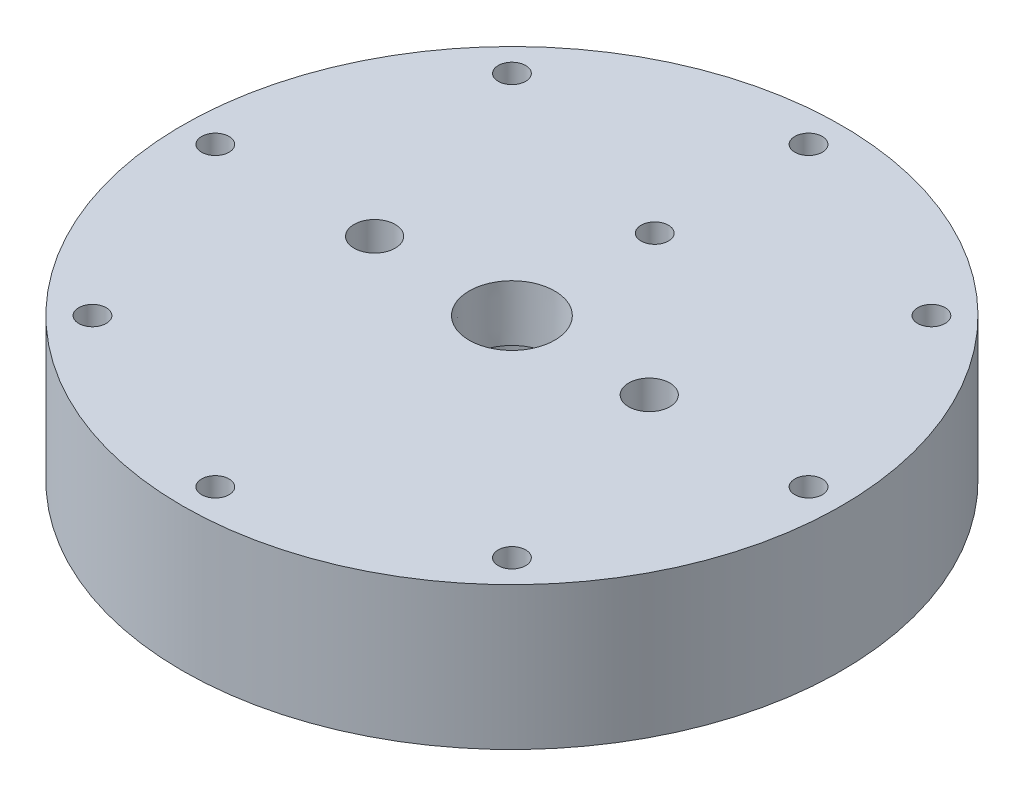
ISO-10303-21;
HEADER;
FILE_DESCRIPTION(('STEP AP214'),'2;1');
FILE_NAME('part.step','',(''),(''),'','','');
FILE_SCHEMA(('AUTOMOTIVE_DESIGN { 1 0 10303 214 1 1 1 1 }'));
ENDSEC;
DATA;
#1=APPLICATION_CONTEXT('core data for automotive mechanical design processes');
#2=APPLICATION_PROTOCOL_DEFINITION('international standard','automotive_design',2000,#1);
#3=PRODUCT_CONTEXT('',#1,'mechanical');
#4=PRODUCT('Part','Part','',(#3));
#5=PRODUCT_RELATED_PRODUCT_CATEGORY('part','',(#4));
#6=PRODUCT_DEFINITION_FORMATION('','',#4);
#7=PRODUCT_DEFINITION_CONTEXT('part definition',#1,'design');
#8=PRODUCT_DEFINITION('design','',#6,#7);
#9=PRODUCT_DEFINITION_SHAPE('','',#8);
#10=(LENGTH_UNIT() NAMED_UNIT(*) SI_UNIT(.MILLI.,.METRE.));
#11=(NAMED_UNIT(*) PLANE_ANGLE_UNIT() SI_UNIT($,.RADIAN.));
#12=(NAMED_UNIT(*) SI_UNIT($,.STERADIAN.) SOLID_ANGLE_UNIT());
#13=UNCERTAINTY_MEASURE_WITH_UNIT(LENGTH_MEASURE(1.E-05),#10,'distance_accuracy_value','');
#14=(GEOMETRIC_REPRESENTATION_CONTEXT(3) GLOBAL_UNCERTAINTY_ASSIGNED_CONTEXT((#13)) GLOBAL_UNIT_ASSIGNED_CONTEXT((#10,
#11,#12)) REPRESENTATION_CONTEXT('',''));
#15=CARTESIAN_POINT('',(0.,0.,0.));
#16=DIRECTION('',(0.,0.,1.));
#17=DIRECTION('',(1.,0.,0.));
#18=AXIS2_PLACEMENT_3D('',#15,#16,#17);
#19=CARTESIAN_POINT('',(0.,-40.64,0.));
#20=DIRECTION('',(0.,1.,0.));
#21=DIRECTION('',(0.,0.,1.));
#22=AXIS2_PLACEMENT_3D('',#19,#20,#21);
#23=PLANE('',#22);
#24=CARTESIAN_POINT('',(0.,-40.64,-33.02));
#25=DIRECTION('',(0.,1.,0.));
#26=DIRECTION('',(0.,0.,1.));
#27=AXIS2_PLACEMENT_3D('',#24,#25,#26);
#28=CIRCLE('',#27,3.175);
#29=CARTESIAN_POINT('',(0.,-40.64,-29.845));
#30=VERTEX_POINT('',#29);
#31=EDGE_CURVE('E78',#30,#30,#28,.F.);
#32=ORIENTED_EDGE('',*,*,#31,.F.);
#33=EDGE_LOOP('',(#32));
#34=FACE_BOUND('',#33,.T.);
#35=CARTESIAN_POINT('',(0.,-40.64,-33.02));
#36=DIRECTION('',(0.,1.,0.));
#37=DIRECTION('',(0.,0.,1.));
#38=AXIS2_PLACEMENT_3D('',#35,#36,#37);
#39=CIRCLE('',#38,7.62);
#40=CARTESIAN_POINT('',(0.,-40.64,-40.64));
#41=VERTEX_POINT('',#40);
#42=EDGE_CURVE('E59',#41,#41,#39,.F.);
#43=ORIENTED_EDGE('',*,*,#42,.T.);
#44=EDGE_LOOP('',(#43));
#45=FACE_BOUND('',#44,.T.);
#46=ADVANCED_FACE('F35',(#34,#45),#23,.F.);
#47=CARTESIAN_POINT('',(0.,-36.83,0.));
#48=DIRECTION('',(0.,-1.,0.));
#49=DIRECTION('',(0.,0.,-1.));
#50=AXIS2_PLACEMENT_3D('',#47,#48,#49);
#51=CYLINDRICAL_SURFACE('',#50,19.05);
#52=CARTESIAN_POINT('',(0.,-40.64,0.));
#53=DIRECTION('',(0.,1.,0.));
#54=DIRECTION('',(0.,0.,1.));
#55=AXIS2_PLACEMENT_3D('',#52,#53,#54);
#56=CIRCLE('',#55,19.05);
#57=CARTESIAN_POINT('',(0.,-40.64,19.05));
#58=VERTEX_POINT('',#57);
#59=EDGE_CURVE('E55',#58,#58,#56,.T.);
#60=ORIENTED_EDGE('',*,*,#59,.F.);
#61=EDGE_LOOP('',(#60));
#62=FACE_BOUND('',#61,.T.);
#63=CARTESIAN_POINT('',(0.,-36.83,0.));
#64=DIRECTION('',(0.,1.,0.));
#65=DIRECTION('',(0.,0.,1.));
#66=AXIS2_PLACEMENT_3D('',#63,#64,#65);
#67=CIRCLE('',#66,19.05);
#68=CARTESIAN_POINT('',(0.,-36.83,19.05));
#69=VERTEX_POINT('',#68);
#70=EDGE_CURVE('E43',#69,#69,#67,.T.);
#71=ORIENTED_EDGE('',*,*,#70,.T.);
#72=EDGE_LOOP('',(#71));
#73=FACE_BOUND('',#72,.T.);
#74=ADVANCED_FACE('F170',(#62,#73),#51,.F.);
#75=CARTESIAN_POINT('',(0.,-36.83,0.));
#76=DIRECTION('',(0.,1.,0.));
#77=DIRECTION('',(0.,0.,1.));
#78=AXIS2_PLACEMENT_3D('',#75,#76,#77);
#79=PLANE('',#78);
#80=CARTESIAN_POINT('',(0.,-36.83,0.));
#81=DIRECTION('',(0.,1.,0.));
#82=DIRECTION('',(0.,0.,1.));
#83=AXIS2_PLACEMENT_3D('',#80,#81,#82);
#84=CIRCLE('',#83,13.97);
#85=CARTESIAN_POINT('',(0.,-36.83,13.97));
#86=VERTEX_POINT('',#85);
#87=EDGE_CURVE('E48',#86,#86,#84,.F.);
#88=ORIENTED_EDGE('',*,*,#87,.F.);
#89=EDGE_LOOP('',(#88));
#90=FACE_BOUND('',#89,.T.);
#91=ORIENTED_EDGE('',*,*,#70,.F.);
#92=EDGE_LOOP('',(#91));
#93=FACE_BOUND('',#92,.T.);
#94=ADVANCED_FACE('F165',(#90,#93),#79,.F.);
#95=CARTESIAN_POINT('',(0.,-30.48,0.));
#96=DIRECTION('',(0.,-1.,0.));
#97=DIRECTION('',(0.,0.,-1.));
#98=AXIS2_PLACEMENT_3D('',#95,#96,#97);
#99=CYLINDRICAL_SURFACE('',#98,13.97);
#100=CARTESIAN_POINT('',(0.,-30.48,0.));
#101=DIRECTION('',(0.,1.,0.));
#102=DIRECTION('',(0.,0.,1.));
#103=AXIS2_PLACEMENT_3D('',#100,#101,#102);
#104=CIRCLE('',#103,13.97);
#105=CARTESIAN_POINT('',(0.,-30.48,13.97));
#106=VERTEX_POINT('',#105);
#107=EDGE_CURVE('E54',#106,#106,#104,.T.);
#108=ORIENTED_EDGE('',*,*,#107,.T.);
#109=EDGE_LOOP('',(#108));
#110=FACE_BOUND('',#109,.T.);
#111=ORIENTED_EDGE('',*,*,#87,.T.);
#112=EDGE_LOOP('',(#111));
#113=FACE_BOUND('',#112,.T.);
#114=ADVANCED_FACE('F150',(#110,#113),#99,.F.);
#115=CARTESIAN_POINT('',(0.,-30.48,0.));
#116=DIRECTION('',(0.,1.,0.));
#117=DIRECTION('',(0.,0.,1.));
#118=AXIS2_PLACEMENT_3D('',#115,#116,#117);
#119=PLANE('',#118);
#120=CARTESIAN_POINT('',(0.,-30.48,0.));
#121=DIRECTION('',(0.,1.,0.));
#122=DIRECTION('',(0.,0.,1.));
#123=AXIS2_PLACEMENT_3D('',#120,#121,#122);
#124=CIRCLE('',#123,9.50254209253425);
#125=CARTESIAN_POINT('',(0.,-30.48,9.50254209253425));
#126=VERTEX_POINT('',#125);
#127=EDGE_CURVE('E72',#126,#126,#124,.T.);
#128=ORIENTED_EDGE('',*,*,#127,.T.);
#129=EDGE_LOOP('',(#128));
#130=FACE_BOUND('',#129,.T.);
#131=ORIENTED_EDGE('',*,*,#107,.F.);
#132=EDGE_LOOP('',(#131));
#133=FACE_BOUND('',#132,.T.);
#134=ADVANCED_FACE('F153',(#130,#133),#119,.F.);
#135=CARTESIAN_POINT('',(0.,-40.64,0.));
#136=DIRECTION('',(0.,-1.,0.));
#137=DIRECTION('',(0.,0.,-1.));
#138=AXIS2_PLACEMENT_3D('',#135,#136,#137);
#139=CYLINDRICAL_SURFACE('',#138,57.15);
#140=CARTESIAN_POINT('',(0.,-40.64,0.));
#141=DIRECTION('',(0.,1.,0.));
#142=DIRECTION('',(0.,0.,1.));
#143=AXIS2_PLACEMENT_3D('',#140,#141,#142);
#144=CIRCLE('',#143,57.15);
#145=CARTESIAN_POINT('',(0.,-40.64,57.15));
#146=VERTEX_POINT('',#145);
#147=EDGE_CURVE('E58',#146,#146,#144,.T.);
#148=ORIENTED_EDGE('',*,*,#147,.T.);
#149=EDGE_LOOP('',(#148));
#150=FACE_BOUND('',#149,.T.);
#151=CARTESIAN_POINT('',(0.,-50.8,0.));
#152=DIRECTION('',(0.,1.,0.));
#153=DIRECTION('',(0.,0.,1.));
#154=AXIS2_PLACEMENT_3D('',#151,#152,#153);
#155=CIRCLE('',#154,57.15);
#156=CARTESIAN_POINT('',(0.,-50.8,57.15));
#157=VERTEX_POINT('',#156);
#158=EDGE_CURVE('E89',#157,#157,#155,.T.);
#159=ORIENTED_EDGE('',*,*,#158,.F.);
#160=EDGE_LOOP('',(#159));
#161=FACE_BOUND('',#160,.T.);
#162=ADVANCED_FACE('F155',(#150,#161),#139,.F.);
#163=CARTESIAN_POINT('',(0.,-40.64,-33.02));
#164=DIRECTION('',(0.,1.,0.));
#165=DIRECTION('',(0.,0.,1.));
#166=AXIS2_PLACEMENT_3D('',#163,#164,#165);
#167=CIRCLE('',#166,10.16);
#168=CARTESIAN_POINT('',(0.,-40.64,-43.18));
#169=VERTEX_POINT('',#168);
#170=EDGE_CURVE('E39',#169,#169,#167,.F.);
#171=ORIENTED_EDGE('',*,*,#170,.F.);
#172=EDGE_LOOP('',(#171));
#173=FACE_BOUND('',#172,.T.);
#174=CARTESIAN_POINT('',(-31.75,-40.64,0.));
#175=DIRECTION('',(0.,1.,0.));
#176=DIRECTION('',(0.,0.,1.));
#177=AXIS2_PLACEMENT_3D('',#174,#175,#176);
#178=CIRCLE('',#177,4.7625);
#179=CARTESIAN_POINT('',(-31.75,-40.64,4.7625));
#180=VERTEX_POINT('',#179);
#181=EDGE_CURVE('E85',#180,#180,#178,.F.);
#182=ORIENTED_EDGE('',*,*,#181,.F.);
#183=EDGE_LOOP('',(#182));
#184=FACE_BOUND('',#183,.T.);
#185=CARTESIAN_POINT('',(31.75,-40.64,0.));
#186=DIRECTION('',(0.,1.,0.));
#187=DIRECTION('',(0.,0.,1.));
#188=AXIS2_PLACEMENT_3D('',#185,#186,#187);
#189=CIRCLE('',#188,4.7625);
#190=CARTESIAN_POINT('',(31.75,-40.64,4.7625));
#191=VERTEX_POINT('',#190);
#192=EDGE_CURVE('E86',#191,#191,#189,.F.);
#193=ORIENTED_EDGE('',*,*,#192,.F.);
#194=EDGE_LOOP('',(#193));
#195=FACE_BOUND('',#194,.T.);
#196=ORIENTED_EDGE('',*,*,#59,.T.);
#197=EDGE_LOOP('',(#196));
#198=FACE_BOUND('',#197,.T.);
#199=ORIENTED_EDGE('',*,*,#147,.F.);
#200=EDGE_LOOP('',(#199));
#201=FACE_BOUND('',#200,.T.);
#202=ADVANCED_FACE('F162',(#173,#184,#195,#198,#201),#23,.F.);
#203=CARTESIAN_POINT('',(0.,-17.78,0.));
#204=DIRECTION('',(0.,1.,0.));
#205=DIRECTION('',(0.,0.,1.));
#206=AXIS2_PLACEMENT_3D('',#203,#204,#205);
#207=PLANE('',#206);
#208=CARTESIAN_POINT('',(0.,-17.78,0.));
#209=DIRECTION('',(0.,1.,0.));
#210=DIRECTION('',(0.,0.,1.));
#211=AXIS2_PLACEMENT_3D('',#208,#209,#210);
#212=CIRCLE('',#211,9.8827971);
#213=CARTESIAN_POINT('',(0.,-17.78,9.8827971));
#214=VERTEX_POINT('',#213);
#215=EDGE_CURVE('E464',#214,#214,#212,.T.);
#216=ORIENTED_EDGE('',*,*,#215,.F.);
#217=EDGE_LOOP('',(#216));
#218=FACE_BOUND('',#217,.T.);
#219=CARTESIAN_POINT('',(0.,-17.78,-33.02));
#220=DIRECTION('',(0.,1.,0.));
#221=DIRECTION('',(0.,0.,1.));
#222=AXIS2_PLACEMENT_3D('',#219,#220,#221);
#223=CIRCLE('',#222,3.175);
#224=CARTESIAN_POINT('',(0.,-17.78,-29.845));
#225=VERTEX_POINT('',#224);
#226=EDGE_CURVE('E65',#225,#225,#223,.F.);
#227=ORIENTED_EDGE('',*,*,#226,.T.);
#228=EDGE_LOOP('',(#227));
#229=FACE_BOUND('',#228,.T.);
#230=CARTESIAN_POINT('',(-31.75,-17.78,0.));
#231=DIRECTION('',(0.,1.,0.));
#232=DIRECTION('',(0.,0.,1.));
#233=AXIS2_PLACEMENT_3D('',#230,#231,#232);
#234=CIRCLE('',#233,4.7625);
#235=CARTESIAN_POINT('',(-31.75,-17.78,4.7625));
#236=VERTEX_POINT('',#235);
#237=EDGE_CURVE('E82',#236,#236,#234,.F.);
#238=ORIENTED_EDGE('',*,*,#237,.T.);
#239=EDGE_LOOP('',(#238));
#240=FACE_BOUND('',#239,.T.);
#241=CARTESIAN_POINT('',(31.75,-17.78,0.));
#242=DIRECTION('',(0.,1.,0.));
#243=DIRECTION('',(0.,0.,1.));
#244=AXIS2_PLACEMENT_3D('',#241,#242,#243);
#245=CIRCLE('',#244,4.7625);
#246=CARTESIAN_POINT('',(31.75,-17.78,4.7625));
#247=VERTEX_POINT('',#246);
#248=EDGE_CURVE('E81',#247,#247,#245,.F.);
#249=ORIENTED_EDGE('',*,*,#248,.T.);
#250=EDGE_LOOP('',(#249));
#251=FACE_BOUND('',#250,.T.);
#252=CARTESIAN_POINT('',(68.58,-17.78,2.41126874597481E-13));
#253=DIRECTION('',(0.,1.,0.));
#254=DIRECTION('',(0.,0.,1.));
#255=AXIS2_PLACEMENT_3D('',#252,#253,#254);
#256=CIRCLE('',#255,3.175);
#257=CARTESIAN_POINT('',(68.58,-17.78,3.17500000000024));
#258=VERTEX_POINT('',#257);
#259=EDGE_CURVE('E113',#258,#258,#256,.T.);
#260=ORIENTED_EDGE('',*,*,#259,.F.);
#261=EDGE_LOOP('',(#260));
#262=FACE_BOUND('',#261,.T.);
#263=CARTESIAN_POINT('',(48.4933830537732,-17.78,48.4933830537737));
#264=DIRECTION('',(0.,1.,0.));
#265=DIRECTION('',(0.,0.,1.));
#266=AXIS2_PLACEMENT_3D('',#263,#264,#265);
#267=CIRCLE('',#266,3.175);
#268=CARTESIAN_POINT('',(48.4933830537732,-17.78,51.6683830537737));
#269=VERTEX_POINT('',#268);
#270=EDGE_CURVE('E114',#269,#269,#267,.T.);
#271=ORIENTED_EDGE('',*,*,#270,.F.);
#272=EDGE_LOOP('',(#271));
#273=FACE_BOUND('',#272,.T.);
#274=CARTESIAN_POINT('',(0.,-17.78,68.58));
#275=DIRECTION('',(0.,1.,0.));
#276=DIRECTION('',(0.,0.,1.));
#277=AXIS2_PLACEMENT_3D('',#274,#275,#276);
#278=CIRCLE('',#277,3.175);
#279=CARTESIAN_POINT('',(0.,-17.78,71.755));
#280=VERTEX_POINT('',#279);
#281=EDGE_CURVE('E121',#280,#280,#278,.T.);
#282=ORIENTED_EDGE('',*,*,#281,.F.);
#283=EDGE_LOOP('',(#282));
#284=FACE_BOUND('',#283,.T.);
#285=CARTESIAN_POINT('',(-48.4933830537739,-17.78,48.493383053773));
#286=DIRECTION('',(0.,1.,0.));
#287=DIRECTION('',(0.,0.,1.));
#288=AXIS2_PLACEMENT_3D('',#285,#286,#287);
#289=CIRCLE('',#288,3.175);
#290=CARTESIAN_POINT('',(-48.4933830537739,-17.78,51.668383053773));
#291=VERTEX_POINT('',#290);
#292=EDGE_CURVE('E127',#291,#291,#289,.T.);
#293=ORIENTED_EDGE('',*,*,#292,.F.);
#294=EDGE_LOOP('',(#293));
#295=FACE_BOUND('',#294,.T.);
#296=CARTESIAN_POINT('',(-68.58,-17.78,-7.20018455033205E-13));
#297=DIRECTION('',(0.,1.,0.));
#298=DIRECTION('',(0.,0.,1.));
#299=AXIS2_PLACEMENT_3D('',#296,#297,#298);
#300=CIRCLE('',#299,3.175);
#301=CARTESIAN_POINT('',(-68.58,-17.78,3.17499999999928));
#302=VERTEX_POINT('',#301);
#303=EDGE_CURVE('E101',#302,#302,#300,.T.);
#304=ORIENTED_EDGE('',*,*,#303,.F.);
#305=EDGE_LOOP('',(#304));
#306=FACE_BOUND('',#305,.T.);
#307=CARTESIAN_POINT('',(-48.4933830537728,-17.78,-48.493383053774));
#308=DIRECTION('',(0.,1.,0.));
#309=DIRECTION('',(0.,0.,1.));
#310=AXIS2_PLACEMENT_3D('',#307,#308,#309);
#311=CIRCLE('',#310,3.175);
#312=CARTESIAN_POINT('',(-48.4933830537728,-17.78,-45.318383053774));
#313=VERTEX_POINT('',#312);
#314=EDGE_CURVE('E102',#313,#313,#311,.T.);
#315=ORIENTED_EDGE('',*,*,#314,.F.);
#316=EDGE_LOOP('',(#315));
#317=FACE_BOUND('',#316,.T.);
#318=CARTESIAN_POINT('',(48.4933830537735,-17.78,-48.4933830537733));
#319=DIRECTION('',(0.,1.,0.));
#320=DIRECTION('',(0.,0.,1.));
#321=AXIS2_PLACEMENT_3D('',#318,#319,#320);
#322=CIRCLE('',#321,3.175);
#323=CARTESIAN_POINT('',(48.4933830537735,-17.78,-45.3183830537734));
#324=VERTEX_POINT('',#323);
#325=EDGE_CURVE('E136',#324,#324,#322,.T.);
#326=ORIENTED_EDGE('',*,*,#325,.F.);
#327=EDGE_LOOP('',(#326));
#328=FACE_BOUND('',#327,.T.);
#329=CARTESIAN_POINT('',(0.,-17.78,-68.58));
#330=DIRECTION('',(0.,1.,0.));
#331=DIRECTION('',(0.,0.,1.));
#332=AXIS2_PLACEMENT_3D('',#329,#330,#331);
#333=CIRCLE('',#332,3.175);
#334=CARTESIAN_POINT('',(0.,-17.78,-65.405));
#335=VERTEX_POINT('',#334);
#336=EDGE_CURVE('E142',#335,#335,#333,.T.);
#337=ORIENTED_EDGE('',*,*,#336,.F.);
#338=EDGE_LOOP('',(#337));
#339=FACE_BOUND('',#338,.T.);
#340=CARTESIAN_POINT('',(0.,-17.78,0.));
#341=DIRECTION('',(0.,1.,0.));
#342=DIRECTION('',(0.,0.,1.));
#343=AXIS2_PLACEMENT_3D('',#340,#341,#342);
#344=CIRCLE('',#343,76.2);
#345=CARTESIAN_POINT('',(0.,-17.78,76.2));
#346=VERTEX_POINT('',#345);
#347=EDGE_CURVE('E145',#346,#346,#344,.T.);
#348=ORIENTED_EDGE('',*,*,#347,.T.);
#349=EDGE_LOOP('',(#348));
#350=FACE_BOUND('',#349,.T.);
#351=ADVANCED_FACE('F181',(#218,#229,#240,#251,#262,#273,#284,#295,#306,#317,#328,#339,#350),
#207,.T.);
#352=CARTESIAN_POINT('',(0.,-50.8,0.));
#353=DIRECTION('',(0.,1.,0.));
#354=DIRECTION('',(0.,0.,1.));
#355=AXIS2_PLACEMENT_3D('',#352,#353,#354);
#356=CYLINDRICAL_SURFACE('',#355,76.2);
#357=CARTESIAN_POINT('',(0.,-50.8,0.));
#358=DIRECTION('',(0.,1.,0.));
#359=DIRECTION('',(0.,0.,1.));
#360=AXIS2_PLACEMENT_3D('',#357,#358,#359);
#361=CIRCLE('',#360,76.2);
#362=CARTESIAN_POINT('',(0.,-50.8,76.2));
#363=VERTEX_POINT('',#362);
#364=EDGE_CURVE('E10',#363,#363,#361,.T.);
#365=ORIENTED_EDGE('',*,*,#364,.T.);
#366=EDGE_LOOP('',(#365));
#367=FACE_BOUND('',#366,.T.);
#368=ORIENTED_EDGE('',*,*,#347,.F.);
#369=EDGE_LOOP('',(#368));
#370=FACE_BOUND('',#369,.T.);
#371=ADVANCED_FACE('F37',(#367,#370),#356,.T.);
#372=CARTESIAN_POINT('',(0.,-17.779,-68.58));
#373=DIRECTION('',(0.,-1.,0.));
#374=DIRECTION('',(0.,0.,-1.));
#375=AXIS2_PLACEMENT_3D('',#372,#373,#374);
#376=CYLINDRICAL_SURFACE('',#375,3.175);
#377=ORIENTED_EDGE('',*,*,#336,.T.);
#378=EDGE_LOOP('',(#377));
#379=FACE_BOUND('',#378,.T.);
#380=CARTESIAN_POINT('',(0.,-50.8,-68.58));
#381=DIRECTION('',(0.,1.,0.));
#382=DIRECTION('',(0.,0.,1.));
#383=AXIS2_PLACEMENT_3D('',#380,#381,#382);
#384=CIRCLE('',#383,3.175);
#385=CARTESIAN_POINT('',(0.,-50.8,-65.405));
#386=VERTEX_POINT('',#385);
#387=EDGE_CURVE('E139',#386,#386,#384,.T.);
#388=ORIENTED_EDGE('',*,*,#387,.F.);
#389=EDGE_LOOP('',(#388));
#390=FACE_BOUND('',#389,.T.);
#391=ADVANCED_FACE('F221',(#379,#390),#376,.F.);
#392=CARTESIAN_POINT('',(48.4933830537735,-17.779,-48.4933830537733));
#393=DIRECTION('',(0.,-1.,0.));
#394=DIRECTION('',(0.,0.,-1.));
#395=AXIS2_PLACEMENT_3D('',#392,#393,#394);
#396=CYLINDRICAL_SURFACE('',#395,3.175);
#397=ORIENTED_EDGE('',*,*,#325,.T.);
#398=EDGE_LOOP('',(#397));
#399=FACE_BOUND('',#398,.T.);
#400=CARTESIAN_POINT('',(48.4933830537735,-50.8,-48.4933830537733));
#401=DIRECTION('',(0.,1.,0.));
#402=DIRECTION('',(-0.707106781186549,0.,0.707106781186546));
#403=AXIS2_PLACEMENT_3D('',#400,#401,#402);
#404=CIRCLE('',#403,3.175);
#405=CARTESIAN_POINT('',(46.2483190235062,-50.8,-46.2483190235061));
#406=VERTEX_POINT('',#405);
#407=EDGE_CURVE('E117',#406,#406,#404,.T.);
#408=ORIENTED_EDGE('',*,*,#407,.F.);
#409=EDGE_LOOP('',(#408));
#410=FACE_BOUND('',#409,.T.);
#411=ADVANCED_FACE('F223',(#399,#410),#396,.F.);
#412=CARTESIAN_POINT('',(-48.4933830537728,-17.779,-48.493383053774));
#413=DIRECTION('',(0.,-1.,0.));
#414=DIRECTION('',(0.,0.,-1.));
#415=AXIS2_PLACEMENT_3D('',#412,#413,#414);
#416=CYLINDRICAL_SURFACE('',#415,3.175);
#417=ORIENTED_EDGE('',*,*,#314,.T.);
#418=EDGE_LOOP('',(#417));
#419=FACE_BOUND('',#418,.T.);
#420=CARTESIAN_POINT('',(-48.4933830537728,-50.8,-48.493383053774));
#421=DIRECTION('',(0.,1.,0.));
#422=DIRECTION('',(0.707106781186539,0.,0.707106781186556));
#423=AXIS2_PLACEMENT_3D('',#420,#421,#422);
#424=CIRCLE('',#423,3.175);
#425=CARTESIAN_POINT('',(-46.2483190235056,-50.8,-46.2483190235067));
#426=VERTEX_POINT('',#425);
#427=EDGE_CURVE('E57',#426,#426,#424,.T.);
#428=ORIENTED_EDGE('',*,*,#427,.F.);
#429=EDGE_LOOP('',(#428));
#430=FACE_BOUND('',#429,.T.);
#431=ADVANCED_FACE('F230',(#419,#430),#416,.F.);
#432=CARTESIAN_POINT('',(-68.58,-17.779,-7.20018455033205E-13));
#433=DIRECTION('',(0.,-1.,0.));
#434=DIRECTION('',(0.,0.,-1.));
#435=AXIS2_PLACEMENT_3D('',#432,#433,#434);
#436=CYLINDRICAL_SURFACE('',#435,3.175);
#437=ORIENTED_EDGE('',*,*,#303,.T.);
#438=EDGE_LOOP('',(#437));
#439=FACE_BOUND('',#438,.T.);
#440=CARTESIAN_POINT('',(-68.58,-50.8,-7.20018455033205E-13));
#441=DIRECTION('',(0.,1.,0.));
#442=DIRECTION('',(1.,0.,0.));
#443=AXIS2_PLACEMENT_3D('',#440,#441,#442);
#444=CIRCLE('',#443,3.175);
#445=CARTESIAN_POINT('',(-65.405,-50.8,-6.86762095280724E-13));
#446=VERTEX_POINT('',#445);
#447=EDGE_CURVE('E98',#446,#446,#444,.T.);
#448=ORIENTED_EDGE('',*,*,#447,.F.);
#449=EDGE_LOOP('',(#448));
#450=FACE_BOUND('',#449,.T.);
#451=ADVANCED_FACE('F238',(#439,#450),#436,.F.);
#452=CARTESIAN_POINT('',(-48.4933830537739,-17.779,48.493383053773));
#453=DIRECTION('',(0.,-1.,0.));
#454=DIRECTION('',(0.,0.,-1.));
#455=AXIS2_PLACEMENT_3D('',#452,#453,#454);
#456=CYLINDRICAL_SURFACE('',#455,3.175);
#457=ORIENTED_EDGE('',*,*,#292,.T.);
#458=EDGE_LOOP('',(#457));
#459=FACE_BOUND('',#458,.T.);
#460=CARTESIAN_POINT('',(-48.4933830537739,-50.8,48.493383053773));
#461=DIRECTION('',(0.,1.,0.));
#462=DIRECTION('',(0.707106781186554,0.,-0.707106781186541));
#463=AXIS2_PLACEMENT_3D('',#460,#461,#462);
#464=CIRCLE('',#463,3.175);
#465=CARTESIAN_POINT('',(-46.2483190235065,-50.8,46.2483190235057));
#466=VERTEX_POINT('',#465);
#467=EDGE_CURVE('E105',#466,#466,#464,.T.);
#468=ORIENTED_EDGE('',*,*,#467,.F.);
#469=EDGE_LOOP('',(#468));
#470=FACE_BOUND('',#469,.T.);
#471=ADVANCED_FACE('F234',(#459,#470),#456,.F.);
#472=CARTESIAN_POINT('',(0.,-17.779,68.58));
#473=DIRECTION('',(0.,-1.,0.));
#474=DIRECTION('',(0.,0.,-1.));
#475=AXIS2_PLACEMENT_3D('',#472,#473,#474);
#476=CYLINDRICAL_SURFACE('',#475,3.175);
#477=ORIENTED_EDGE('',*,*,#281,.T.);
#478=EDGE_LOOP('',(#477));
#479=FACE_BOUND('',#478,.T.);
#480=CARTESIAN_POINT('',(0.,-50.8,68.58));
#481=DIRECTION('',(0.,1.,0.));
#482=DIRECTION('',(0.,0.,-1.));
#483=AXIS2_PLACEMENT_3D('',#480,#481,#482);
#484=CIRCLE('',#483,3.175);
#485=CARTESIAN_POINT('',(0.,-50.8,65.405));
#486=VERTEX_POINT('',#485);
#487=EDGE_CURVE('E124',#486,#486,#484,.T.);
#488=ORIENTED_EDGE('',*,*,#487,.F.);
#489=EDGE_LOOP('',(#488));
#490=FACE_BOUND('',#489,.T.);
#491=ADVANCED_FACE('F237',(#479,#490),#476,.F.);
#492=CARTESIAN_POINT('',(48.4933830537732,-17.779,48.4933830537737));
#493=DIRECTION('',(0.,-1.,0.));
#494=DIRECTION('',(0.,0.,-1.));
#495=AXIS2_PLACEMENT_3D('',#492,#493,#494);
#496=CYLINDRICAL_SURFACE('',#495,3.175);
#497=ORIENTED_EDGE('',*,*,#270,.T.);
#498=EDGE_LOOP('',(#497));
#499=FACE_BOUND('',#498,.T.);
#500=CARTESIAN_POINT('',(48.4933830537732,-50.8,48.4933830537737));
#501=DIRECTION('',(0.,1.,0.));
#502=DIRECTION('',(-0.707106781186544,0.,-0.707106781186551));
#503=AXIS2_PLACEMENT_3D('',#500,#501,#502);
#504=CIRCLE('',#503,3.175);
#505=CARTESIAN_POINT('',(46.2483190235059,-50.8,46.2483190235064));
#506=VERTEX_POINT('',#505);
#507=EDGE_CURVE('E118',#506,#506,#504,.T.);
#508=ORIENTED_EDGE('',*,*,#507,.F.);
#509=EDGE_LOOP('',(#508));
#510=FACE_BOUND('',#509,.T.);
#511=ADVANCED_FACE('F242',(#499,#510),#496,.F.);
#512=CARTESIAN_POINT('',(68.58,-17.779,2.41126874597481E-13));
#513=DIRECTION('',(0.,-1.,0.));
#514=DIRECTION('',(0.,0.,-1.));
#515=AXIS2_PLACEMENT_3D('',#512,#513,#514);
#516=CYLINDRICAL_SURFACE('',#515,3.175);
#517=ORIENTED_EDGE('',*,*,#259,.T.);
#518=EDGE_LOOP('',(#517));
#519=FACE_BOUND('',#518,.T.);
#520=CARTESIAN_POINT('',(68.58,-50.8,2.41126874597481E-13));
#521=DIRECTION('',(0.,1.,0.));
#522=DIRECTION('',(-1.,0.,0.));
#523=AXIS2_PLACEMENT_3D('',#520,#521,#522);
#524=CIRCLE('',#523,3.175);
#525=CARTESIAN_POINT('',(65.405,-50.8,2.30041421346654E-13));
#526=VERTEX_POINT('',#525);
#527=EDGE_CURVE('E110',#526,#526,#524,.T.);
#528=ORIENTED_EDGE('',*,*,#527,.F.);
#529=EDGE_LOOP('',(#528));
#530=FACE_BOUND('',#529,.T.);
#531=ADVANCED_FACE('F203',(#519,#530),#516,.F.);
#532=CARTESIAN_POINT('',(0.,-50.8,0.));
#533=DIRECTION('',(0.,1.,0.));
#534=DIRECTION('',(0.,0.,1.));
#535=AXIS2_PLACEMENT_3D('',#532,#533,#534);
#536=PLANE('',#535);
#537=ORIENTED_EDGE('',*,*,#158,.T.);
#538=EDGE_LOOP('',(#537));
#539=FACE_BOUND('',#538,.T.);
#540=ORIENTED_EDGE('',*,*,#527,.T.);
#541=EDGE_LOOP('',(#540));
#542=FACE_BOUND('',#541,.T.);
#543=ORIENTED_EDGE('',*,*,#507,.T.);
#544=EDGE_LOOP('',(#543));
#545=FACE_BOUND('',#544,.T.);
#546=ORIENTED_EDGE('',*,*,#487,.T.);
#547=EDGE_LOOP('',(#546));
#548=FACE_BOUND('',#547,.T.);
#549=ORIENTED_EDGE('',*,*,#467,.T.);
#550=EDGE_LOOP('',(#549));
#551=FACE_BOUND('',#550,.T.);
#552=ORIENTED_EDGE('',*,*,#447,.T.);
#553=EDGE_LOOP('',(#552));
#554=FACE_BOUND('',#553,.T.);
#555=ORIENTED_EDGE('',*,*,#427,.T.);
#556=EDGE_LOOP('',(#555));
#557=FACE_BOUND('',#556,.T.);
#558=ORIENTED_EDGE('',*,*,#407,.T.);
#559=EDGE_LOOP('',(#558));
#560=FACE_BOUND('',#559,.T.);
#561=ORIENTED_EDGE('',*,*,#387,.T.);
#562=EDGE_LOOP('',(#561));
#563=FACE_BOUND('',#562,.T.);
#564=ORIENTED_EDGE('',*,*,#364,.F.);
#565=EDGE_LOOP('',(#564));
#566=FACE_BOUND('',#565,.T.);
#567=ADVANCED_FACE('F199',(#539,#542,#545,#548,#551,#554,#557,#560,#563,#566),#536,.F.);
#568=CARTESIAN_POINT('',(31.75,-50.801,0.));
#569=DIRECTION('',(0.,1.,0.));
#570=DIRECTION('',(0.,0.,1.));
#571=AXIS2_PLACEMENT_3D('',#568,#569,#570);
#572=CYLINDRICAL_SURFACE('',#571,4.7625);
#573=ORIENTED_EDGE('',*,*,#248,.F.);
#574=EDGE_LOOP('',(#573));
#575=FACE_BOUND('',#574,.T.);
#576=ORIENTED_EDGE('',*,*,#192,.T.);
#577=EDGE_LOOP('',(#576));
#578=FACE_BOUND('',#577,.T.);
#579=ADVANCED_FACE('F202',(#575,#578),#572,.F.);
#580=CARTESIAN_POINT('',(-31.75,-50.801,0.));
#581=DIRECTION('',(0.,1.,0.));
#582=DIRECTION('',(0.,0.,1.));
#583=AXIS2_PLACEMENT_3D('',#580,#581,#582);
#584=CYLINDRICAL_SURFACE('',#583,4.7625);
#585=ORIENTED_EDGE('',*,*,#237,.F.);
#586=EDGE_LOOP('',(#585));
#587=FACE_BOUND('',#586,.T.);
#588=ORIENTED_EDGE('',*,*,#181,.T.);
#589=EDGE_LOOP('',(#588));
#590=FACE_BOUND('',#589,.T.);
#591=ADVANCED_FACE('F301',(#587,#590),#584,.F.);
#592=CARTESIAN_POINT('',(0.,-50.801,-33.02));
#593=DIRECTION('',(0.,1.,0.));
#594=DIRECTION('',(0.,0.,1.));
#595=AXIS2_PLACEMENT_3D('',#592,#593,#594);
#596=CYLINDRICAL_SURFACE('',#595,3.175);
#597=ORIENTED_EDGE('',*,*,#226,.F.);
#598=EDGE_LOOP('',(#597));
#599=FACE_BOUND('',#598,.T.);
#600=ORIENTED_EDGE('',*,*,#31,.T.);
#601=EDGE_LOOP('',(#600));
#602=FACE_BOUND('',#601,.T.);
#603=ADVANCED_FACE('F308',(#599,#602),#596,.F.);
#604=CARTESIAN_POINT('',(0.,-38.608,-33.02));
#605=DIRECTION('',(0.,-1.,0.));
#606=DIRECTION('',(0.,0.,-1.));
#607=AXIS2_PLACEMENT_3D('',#604,#605,#606);
#608=CYLINDRICAL_SURFACE('',#607,10.16);
#609=CARTESIAN_POINT('',(0.,-38.608,-33.02));
#610=DIRECTION('',(0.,1.,0.));
#611=DIRECTION('',(0.,0.,1.));
#612=AXIS2_PLACEMENT_3D('',#609,#610,#611);
#613=CIRCLE('',#612,10.16);
#614=CARTESIAN_POINT('',(0.,-38.608,-43.18));
#615=VERTEX_POINT('',#614);
#616=EDGE_CURVE('E61',#615,#615,#613,.T.);
#617=CARTESIAN_POINT('',(0.,-38.608,-43.18));
#618=CARTESIAN_POINT('',(0.,-38.6291666666667,-43.18));
#619=CARTESIAN_POINT('',(0.,-38.6503333333333,-43.18));
#620=CARTESIAN_POINT('',(0.,-38.6926666666667,-43.18));
#621=CARTESIAN_POINT('',(0.,-38.7138333333333,-43.18));
#622=CARTESIAN_POINT('',(0.,-38.7561666666667,-43.18));
#623=CARTESIAN_POINT('',(0.,-38.7773333333333,-43.18));
#624=CARTESIAN_POINT('',(0.,-38.8196666666667,-43.18));
#625=CARTESIAN_POINT('',(0.,-38.8408333333333,-43.18));
#626=CARTESIAN_POINT('',(0.,-38.8831666666667,-43.18));
#627=CARTESIAN_POINT('',(0.,-38.9043333333333,-43.18));
#628=CARTESIAN_POINT('',(0.,-38.9466666666667,-43.18));
#629=CARTESIAN_POINT('',(0.,-38.9678333333333,-43.18));
#630=CARTESIAN_POINT('',(0.,-39.0101666666667,-43.18));
#631=CARTESIAN_POINT('',(0.,-39.0313333333333,-43.18));
#632=CARTESIAN_POINT('',(0.,-39.0736666666667,-43.18));
#633=CARTESIAN_POINT('',(0.,-39.0948333333333,-43.18));
#634=CARTESIAN_POINT('',(0.,-39.1371666666667,-43.18));
#635=CARTESIAN_POINT('',(0.,-39.1583333333333,-43.18));
#636=CARTESIAN_POINT('',(0.,-39.2006666666667,-43.18));
#637=CARTESIAN_POINT('',(0.,-39.2218333333333,-43.18));
#638=CARTESIAN_POINT('',(0.,-39.2641666666667,-43.18));
#639=CARTESIAN_POINT('',(0.,-39.2853333333333,-43.18));
#640=CARTESIAN_POINT('',(0.,-39.3276666666667,-43.18));
#641=CARTESIAN_POINT('',(0.,-39.3488333333333,-43.18));
#642=CARTESIAN_POINT('',(0.,-39.3911666666667,-43.18));
#643=CARTESIAN_POINT('',(0.,-39.4123333333333,-43.18));
#644=CARTESIAN_POINT('',(0.,-39.4546666666667,-43.18));
#645=CARTESIAN_POINT('',(0.,-39.4758333333333,-43.18));
#646=CARTESIAN_POINT('',(0.,-39.5181666666667,-43.18));
#647=CARTESIAN_POINT('',(0.,-39.5393333333333,-43.18));
#648=CARTESIAN_POINT('',(0.,-39.5816666666667,-43.18));
#649=CARTESIAN_POINT('',(0.,-39.6028333333333,-43.18));
#650=CARTESIAN_POINT('',(0.,-39.6451666666667,-43.18));
#651=CARTESIAN_POINT('',(0.,-39.6663333333333,-43.18));
#652=CARTESIAN_POINT('',(0.,-39.7086666666667,-43.18));
#653=CARTESIAN_POINT('',(0.,-39.7298333333333,-43.18));
#654=CARTESIAN_POINT('',(0.,-39.7721666666667,-43.18));
#655=CARTESIAN_POINT('',(0.,-39.7933333333333,-43.18));
#656=CARTESIAN_POINT('',(0.,-39.8356666666667,-43.18));
#657=CARTESIAN_POINT('',(0.,-39.8568333333333,-43.18));
#658=CARTESIAN_POINT('',(0.,-39.8991666666667,-43.18));
#659=CARTESIAN_POINT('',(0.,-39.9203333333333,-43.18));
#660=CARTESIAN_POINT('',(0.,-39.9626666666667,-43.18));
#661=CARTESIAN_POINT('',(0.,-39.9838333333333,-43.18));
#662=CARTESIAN_POINT('',(0.,-40.0261666666667,-43.18));
#663=CARTESIAN_POINT('',(0.,-40.0473333333333,-43.18));
#664=CARTESIAN_POINT('',(0.,-40.0896666666667,-43.18));
#665=CARTESIAN_POINT('',(0.,-40.1108333333333,-43.18));
#666=CARTESIAN_POINT('',(0.,-40.1531666666667,-43.18));
#667=CARTESIAN_POINT('',(0.,-40.1743333333333,-43.18));
#668=CARTESIAN_POINT('',(0.,-40.2166666666667,-43.18));
#669=CARTESIAN_POINT('',(0.,-40.2378333333333,-43.18));
#670=CARTESIAN_POINT('',(0.,-40.2801666666667,-43.18));
#671=CARTESIAN_POINT('',(0.,-40.3013333333333,-43.18));
#672=CARTESIAN_POINT('',(0.,-40.3436666666667,-43.18));
#673=CARTESIAN_POINT('',(0.,-40.3648333333333,-43.18));
#674=CARTESIAN_POINT('',(0.,-40.4071666666667,-43.18));
#675=CARTESIAN_POINT('',(0.,-40.4283333333333,-43.18));
#676=CARTESIAN_POINT('',(0.,-40.4706666666667,-43.18));
#677=CARTESIAN_POINT('',(0.,-40.4918333333333,-43.18));
#678=CARTESIAN_POINT('',(0.,-40.5341666666667,-43.18));
#679=CARTESIAN_POINT('',(0.,-40.5553333333333,-43.18));
#680=CARTESIAN_POINT('',(0.,-40.5976666666667,-43.18));
#681=CARTESIAN_POINT('',(0.,-40.6188333333333,-43.18));
#682=CARTESIAN_POINT('',(0.,-40.64,-43.18));
#683=B_SPLINE_CURVE_WITH_KNOTS('',3,(#617,#618,#619,#620,#621,#622,#623,#624,#625,#626,#627,
#628,#629,#630,#631,#632,#633,#634,#635,#636,#637,#638,#639,#640,#641,#642,#643,#644,#645,#646,
#647,#648,#649,#650,#651,#652,#653,#654,#655,#656,#657,#658,#659,#660,#661,#662,#663,#664,#665,
#666,#667,#668,#669,#670,#671,#672,#673,#674,#675,#676,#677,#678,#679,#680,#681,#682),
.UNSPECIFIED.,.F.,.F.,(4,2,2,2,2,2,2,2,2,2,2,2,2,2,2,2,2,2,2,2,2,2,2,2,2,2,2,2,2,2,2,2,4),(0.,
0.0634999999999941,0.126999999999995,0.190499999999996,0.253999999999997,0.317499999999998,
0.380999999999999,0.444499999999994,0.507999999999995,0.571499999999996,0.634999999999997,
0.698499999999998,0.761999999999999,0.825499999999993,0.888999999999994,0.952499999999995,1.016,
1.0795,1.143,1.2065,1.26999999999999,1.33349999999999,1.397,1.4605,1.524,1.5875,1.651,
1.71449999999999,1.77799999999999,1.8415,1.905,1.9685,2.032),.UNSPECIFIED.);
#684=EDGE_CURVE('BSEAM316',#615,#169,#683,.T.);
#685=ORIENTED_EDGE('',*,*,#616,.T.);
#686=ORIENTED_EDGE('',*,*,#170,.T.);
#687=ORIENTED_EDGE('',*,*,#684,.T.);
#688=ORIENTED_EDGE('',*,*,#684,.F.);
#689=EDGE_LOOP('',(#685,#687,#686,#688));
#690=FACE_BOUND('',#689,.T.);
#691=ADVANCED_FACE('F316',(#690),#608,.F.);
#692=CARTESIAN_POINT('',(0.,-38.608,-33.02));
#693=DIRECTION('',(0.,-1.,0.));
#694=DIRECTION('',(0.,0.,-1.));
#695=AXIS2_PLACEMENT_3D('',#692,#693,#694);
#696=CYLINDRICAL_SURFACE('',#695,7.62);
#697=CARTESIAN_POINT('',(0.,-38.608,-33.02));
#698=DIRECTION('',(0.,1.,0.));
#699=DIRECTION('',(0.,0.,1.));
#700=AXIS2_PLACEMENT_3D('',#697,#698,#699);
#701=CIRCLE('',#700,7.62);
#702=CARTESIAN_POINT('',(0.,-38.608,-40.64));
#703=VERTEX_POINT('',#702);
#704=EDGE_CURVE('E67',#703,#703,#701,.T.);
#705=CARTESIAN_POINT('',(0.,-38.608,-40.64));
#706=CARTESIAN_POINT('',(0.,-38.6291666666667,-40.64));
#707=CARTESIAN_POINT('',(0.,-38.6503333333333,-40.64));
#708=CARTESIAN_POINT('',(0.,-38.6926666666667,-40.64));
#709=CARTESIAN_POINT('',(0.,-38.7138333333333,-40.64));
#710=CARTESIAN_POINT('',(0.,-38.7561666666667,-40.64));
#711=CARTESIAN_POINT('',(0.,-38.7773333333333,-40.64));
#712=CARTESIAN_POINT('',(0.,-38.8196666666667,-40.64));
#713=CARTESIAN_POINT('',(0.,-38.8408333333333,-40.64));
#714=CARTESIAN_POINT('',(0.,-38.8831666666667,-40.64));
#715=CARTESIAN_POINT('',(0.,-38.9043333333333,-40.64));
#716=CARTESIAN_POINT('',(0.,-38.9466666666667,-40.64));
#717=CARTESIAN_POINT('',(0.,-38.9678333333333,-40.64));
#718=CARTESIAN_POINT('',(0.,-39.0101666666667,-40.64));
#719=CARTESIAN_POINT('',(0.,-39.0313333333333,-40.64));
#720=CARTESIAN_POINT('',(0.,-39.0736666666667,-40.64));
#721=CARTESIAN_POINT('',(0.,-39.0948333333333,-40.64));
#722=CARTESIAN_POINT('',(0.,-39.1371666666667,-40.64));
#723=CARTESIAN_POINT('',(0.,-39.1583333333333,-40.64));
#724=CARTESIAN_POINT('',(0.,-39.2006666666667,-40.64));
#725=CARTESIAN_POINT('',(0.,-39.2218333333333,-40.64));
#726=CARTESIAN_POINT('',(0.,-39.2641666666667,-40.64));
#727=CARTESIAN_POINT('',(0.,-39.2853333333333,-40.64));
#728=CARTESIAN_POINT('',(0.,-39.3276666666667,-40.64));
#729=CARTESIAN_POINT('',(0.,-39.3488333333333,-40.64));
#730=CARTESIAN_POINT('',(0.,-39.3911666666667,-40.64));
#731=CARTESIAN_POINT('',(0.,-39.4123333333333,-40.64));
#732=CARTESIAN_POINT('',(0.,-39.4546666666667,-40.64));
#733=CARTESIAN_POINT('',(0.,-39.4758333333333,-40.64));
#734=CARTESIAN_POINT('',(0.,-39.5181666666667,-40.64));
#735=CARTESIAN_POINT('',(0.,-39.5393333333333,-40.64));
#736=CARTESIAN_POINT('',(0.,-39.5816666666667,-40.64));
#737=CARTESIAN_POINT('',(0.,-39.6028333333333,-40.64));
#738=CARTESIAN_POINT('',(0.,-39.6451666666667,-40.64));
#739=CARTESIAN_POINT('',(0.,-39.6663333333333,-40.64));
#740=CARTESIAN_POINT('',(0.,-39.7086666666667,-40.64));
#741=CARTESIAN_POINT('',(0.,-39.7298333333333,-40.64));
#742=CARTESIAN_POINT('',(0.,-39.7721666666667,-40.64));
#743=CARTESIAN_POINT('',(0.,-39.7933333333333,-40.64));
#744=CARTESIAN_POINT('',(0.,-39.8356666666667,-40.64));
#745=CARTESIAN_POINT('',(0.,-39.8568333333333,-40.64));
#746=CARTESIAN_POINT('',(0.,-39.8991666666667,-40.64));
#747=CARTESIAN_POINT('',(0.,-39.9203333333333,-40.64));
#748=CARTESIAN_POINT('',(0.,-39.9626666666667,-40.64));
#749=CARTESIAN_POINT('',(0.,-39.9838333333333,-40.64));
#750=CARTESIAN_POINT('',(0.,-40.0261666666667,-40.64));
#751=CARTESIAN_POINT('',(0.,-40.0473333333333,-40.64));
#752=CARTESIAN_POINT('',(0.,-40.0896666666667,-40.64));
#753=CARTESIAN_POINT('',(0.,-40.1108333333333,-40.64));
#754=CARTESIAN_POINT('',(0.,-40.1531666666667,-40.64));
#755=CARTESIAN_POINT('',(0.,-40.1743333333333,-40.64));
#756=CARTESIAN_POINT('',(0.,-40.2166666666667,-40.64));
#757=CARTESIAN_POINT('',(0.,-40.2378333333333,-40.64));
#758=CARTESIAN_POINT('',(0.,-40.2801666666667,-40.64));
#759=CARTESIAN_POINT('',(0.,-40.3013333333333,-40.64));
#760=CARTESIAN_POINT('',(0.,-40.3436666666667,-40.64));
#761=CARTESIAN_POINT('',(0.,-40.3648333333333,-40.64));
#762=CARTESIAN_POINT('',(0.,-40.4071666666667,-40.64));
#763=CARTESIAN_POINT('',(0.,-40.4283333333333,-40.64));
#764=CARTESIAN_POINT('',(0.,-40.4706666666667,-40.64));
#765=CARTESIAN_POINT('',(0.,-40.4918333333333,-40.64));
#766=CARTESIAN_POINT('',(0.,-40.5341666666667,-40.64));
#767=CARTESIAN_POINT('',(0.,-40.5553333333333,-40.64));
#768=CARTESIAN_POINT('',(0.,-40.5976666666667,-40.64));
#769=CARTESIAN_POINT('',(0.,-40.6188333333333,-40.64));
#770=CARTESIAN_POINT('',(0.,-40.64,-40.64));
#771=B_SPLINE_CURVE_WITH_KNOTS('',3,(#705,#706,#707,#708,#709,#710,#711,#712,#713,#714,#715,
#716,#717,#718,#719,#720,#721,#722,#723,#724,#725,#726,#727,#728,#729,#730,#731,#732,#733,#734,
#735,#736,#737,#738,#739,#740,#741,#742,#743,#744,#745,#746,#747,#748,#749,#750,#751,#752,#753,
#754,#755,#756,#757,#758,#759,#760,#761,#762,#763,#764,#765,#766,#767,#768,#769,#770),
.UNSPECIFIED.,.F.,.F.,(4,2,2,2,2,2,2,2,2,2,2,2,2,2,2,2,2,2,2,2,2,2,2,2,2,2,2,2,2,2,2,2,4),(0.,
0.0634999999999941,0.126999999999995,0.190499999999996,0.253999999999997,0.317499999999998,
0.380999999999999,0.444499999999994,0.507999999999995,0.571499999999996,0.634999999999997,
0.698499999999998,0.761999999999999,0.825499999999993,0.888999999999994,0.952499999999995,1.016,
1.0795,1.143,1.2065,1.26999999999999,1.33349999999999,1.397,1.4605,1.524,1.5875,1.651,
1.71449999999999,1.77799999999999,1.8415,1.905,1.9685,2.032),.UNSPECIFIED.);
#772=EDGE_CURVE('BSEAM324',#703,#41,#771,.T.);
#773=ORIENTED_EDGE('',*,*,#704,.F.);
#774=ORIENTED_EDGE('',*,*,#42,.F.);
#775=ORIENTED_EDGE('',*,*,#772,.T.);
#776=ORIENTED_EDGE('',*,*,#772,.F.);
#777=EDGE_LOOP('',(#773,#775,#774,#776));
#778=FACE_BOUND('',#777,.T.);
#779=ADVANCED_FACE('F324',(#778),#696,.T.);
#780=CARTESIAN_POINT('',(0.,-38.608,-33.02));
#781=DIRECTION('',(0.,1.,0.));
#782=DIRECTION('',(0.,0.,1.));
#783=AXIS2_PLACEMENT_3D('',#780,#781,#782);
#784=PLANE('',#783);
#785=ORIENTED_EDGE('',*,*,#616,.F.);
#786=EDGE_LOOP('',(#785));
#787=FACE_BOUND('',#786,.T.);
#788=ORIENTED_EDGE('',*,*,#704,.T.);
#789=EDGE_LOOP('',(#788));
#790=FACE_BOUND('',#789,.T.);
#791=ADVANCED_FACE('F331',(#787,#790),#784,.F.);
#792=CARTESIAN_POINT('',(0.,-17.78,0.));
#793=DIRECTION('',(0.,1.,0.));
#794=DIRECTION('',(0.,0.,1.));
#795=AXIS2_PLACEMENT_3D('',#792,#793,#794);
#796=CONICAL_SURFACE('',#795,9.8827971,0.0299323966717032);
#797=ORIENTED_EDGE('',*,*,#215,.T.);
#798=EDGE_LOOP('',(#797));
#799=FACE_BOUND('',#798,.T.);
#800=ORIENTED_EDGE('',*,*,#127,.F.);
#801=EDGE_LOOP('',(#800));
#802=FACE_BOUND('',#801,.T.);
#803=ADVANCED_FACE('F339',(#799,#802),#796,.F.);
#804=CLOSED_SHELL('',(#46,#74,#94,#114,#134,#162,#202,#351,#371,#391,#411,#431,#451,#471,#491,
#511,#531,#567,#579,#591,#603,#691,#779,#791,#803));
#805=MANIFOLD_SOLID_BREP('B2',#804);
#806=ADVANCED_BREP_SHAPE_REPRESENTATION('',(#18,#805),#14);
#807=SHAPE_DEFINITION_REPRESENTATION(#9,#806);
ENDSEC;
END-ISO-10303-21;
